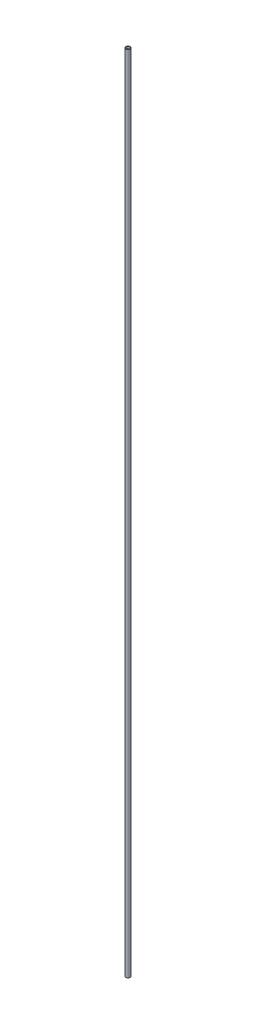
ISO-10303-21;
HEADER;
FILE_DESCRIPTION(('STEP AP214'),'2;1');
FILE_NAME('part.step','',(''),(''),'','','');
FILE_SCHEMA(('AUTOMOTIVE_DESIGN { 1 0 10303 214 1 1 1 1 }'));
ENDSEC;
DATA;
#1=APPLICATION_CONTEXT('core data for automotive mechanical design processes');
#2=APPLICATION_PROTOCOL_DEFINITION('international standard','automotive_design',2000,#1);
#3=PRODUCT_CONTEXT('',#1,'mechanical');
#4=PRODUCT('Part','Part','',(#3));
#5=PRODUCT_RELATED_PRODUCT_CATEGORY('part','',(#4));
#6=PRODUCT_DEFINITION_FORMATION('','',#4);
#7=PRODUCT_DEFINITION_CONTEXT('part definition',#1,'design');
#8=PRODUCT_DEFINITION('design','',#6,#7);
#9=PRODUCT_DEFINITION_SHAPE('','',#8);
#10=(LENGTH_UNIT() NAMED_UNIT(*) SI_UNIT(.MILLI.,.METRE.));
#11=(NAMED_UNIT(*) PLANE_ANGLE_UNIT() SI_UNIT($,.RADIAN.));
#12=(NAMED_UNIT(*) SI_UNIT($,.STERADIAN.) SOLID_ANGLE_UNIT());
#13=UNCERTAINTY_MEASURE_WITH_UNIT(LENGTH_MEASURE(1.E-05),#10,'distance_accuracy_value','');
#14=(GEOMETRIC_REPRESENTATION_CONTEXT(3) GLOBAL_UNCERTAINTY_ASSIGNED_CONTEXT((#13)) GLOBAL_UNIT_ASSIGNED_CONTEXT((#10,
#11,#12)) REPRESENTATION_CONTEXT('',''));
#15=CARTESIAN_POINT('',(0.,0.,0.));
#16=DIRECTION('',(0.,0.,1.));
#17=DIRECTION('',(1.,0.,0.));
#18=AXIS2_PLACEMENT_3D('',#15,#16,#17);
#19=CARTESIAN_POINT('',(0.,889.,0.));
#20=DIRECTION('',(0.,1.,0.));
#21=DIRECTION('',(0.,0.,1.));
#22=AXIS2_PLACEMENT_3D('',#19,#20,#21);
#23=PLANE('',#22);
#24=CARTESIAN_POINT('',(0.,889.,0.));
#25=DIRECTION('',(0.,1.,0.));
#26=DIRECTION('',(0.,0.,1.));
#27=AXIS2_PLACEMENT_3D('',#24,#25,#26);
#28=CIRCLE('',#27,4.7625);
#29=CARTESIAN_POINT('',(0.,889.,4.7625));
#30=VERTEX_POINT('',#29);
#31=EDGE_CURVE('E10',#30,#30,#28,.T.);
#32=ORIENTED_EDGE('',*,*,#31,.T.);
#33=EDGE_LOOP('',(#32));
#34=FACE_BOUND('',#33,.T.);
#35=CARTESIAN_POINT('',(0.,889.,0.));
#36=DIRECTION('',(0.,1.,0.));
#37=DIRECTION('',(0.,0.,1.));
#38=AXIS2_PLACEMENT_3D('',#35,#36,#37);
#39=CIRCLE('',#38,3.7465);
#40=CARTESIAN_POINT('',(0.,889.,3.7465));
#41=VERTEX_POINT('',#40);
#42=EDGE_CURVE('E50',#41,#41,#39,.T.);
#43=ORIENTED_EDGE('',*,*,#42,.F.);
#44=EDGE_LOOP('',(#43));
#45=FACE_BOUND('',#44,.T.);
#46=ADVANCED_FACE('F37',(#34,#45),#23,.T.);
#47=CARTESIAN_POINT('',(0.,-889.,0.));
#48=DIRECTION('',(0.,1.,0.));
#49=DIRECTION('',(0.,0.,1.));
#50=AXIS2_PLACEMENT_3D('',#47,#48,#49);
#51=PLANE('',#50);
#52=CARTESIAN_POINT('',(0.,-889.,0.));
#53=DIRECTION('',(0.,1.,0.));
#54=DIRECTION('',(0.,0.,1.));
#55=AXIS2_PLACEMENT_3D('',#52,#53,#54);
#56=CIRCLE('',#55,4.7625);
#57=CARTESIAN_POINT('',(0.,-889.,4.7625));
#58=VERTEX_POINT('',#57);
#59=EDGE_CURVE('E41',#58,#58,#56,.T.);
#60=ORIENTED_EDGE('',*,*,#59,.F.);
#61=EDGE_LOOP('',(#60));
#62=FACE_BOUND('',#61,.T.);
#63=CARTESIAN_POINT('',(0.,-889.,0.));
#64=DIRECTION('',(0.,1.,0.));
#65=DIRECTION('',(0.,0.,1.));
#66=AXIS2_PLACEMENT_3D('',#63,#64,#65);
#67=CIRCLE('',#66,3.7465);
#68=CARTESIAN_POINT('',(0.,-889.,3.7465));
#69=VERTEX_POINT('',#68);
#70=EDGE_CURVE('E52',#69,#69,#67,.T.);
#71=ORIENTED_EDGE('',*,*,#70,.T.);
#72=EDGE_LOOP('',(#71));
#73=FACE_BOUND('',#72,.T.);
#74=ADVANCED_FACE('F64',(#62,#73),#51,.F.);
#75=CARTESIAN_POINT('',(0.,889.,0.));
#76=DIRECTION('',(0.,-1.,0.));
#77=DIRECTION('',(0.,0.,-1.));
#78=AXIS2_PLACEMENT_3D('',#75,#76,#77);
#79=CYLINDRICAL_SURFACE('',#78,4.7625);
#80=ORIENTED_EDGE('',*,*,#31,.F.);
#81=EDGE_LOOP('',(#80));
#82=FACE_BOUND('',#81,.T.);
#83=ORIENTED_EDGE('',*,*,#59,.T.);
#84=EDGE_LOOP('',(#83));
#85=FACE_BOUND('',#84,.T.);
#86=ADVANCED_FACE('F39',(#82,#85),#79,.T.);
#87=CARTESIAN_POINT('',(0.,889.,0.));
#88=DIRECTION('',(0.,-1.,0.));
#89=DIRECTION('',(0.,0.,-1.));
#90=AXIS2_PLACEMENT_3D('',#87,#88,#89);
#91=CYLINDRICAL_SURFACE('',#90,3.7465);
#92=ORIENTED_EDGE('',*,*,#42,.T.);
#93=EDGE_LOOP('',(#92));
#94=FACE_BOUND('',#93,.T.);
#95=ORIENTED_EDGE('',*,*,#70,.F.);
#96=EDGE_LOOP('',(#95));
#97=FACE_BOUND('',#96,.T.);
#98=ADVANCED_FACE('F60',(#94,#97),#91,.F.);
#99=CLOSED_SHELL('',(#46,#74,#86,#98));
#100=MANIFOLD_SOLID_BREP('B2',#99);
#101=ADVANCED_BREP_SHAPE_REPRESENTATION('',(#18,#100),#14);
#102=SHAPE_DEFINITION_REPRESENTATION(#9,#101);
ENDSEC;
END-ISO-10303-21;
